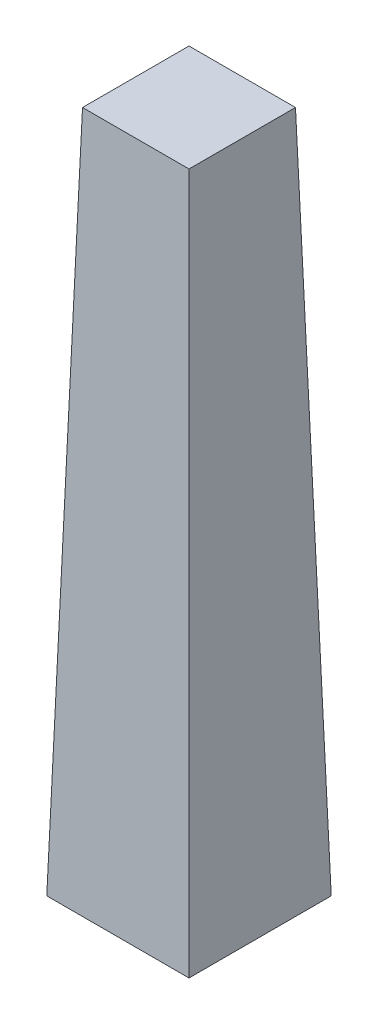
ISO-10303-21;
HEADER;
FILE_DESCRIPTION(('STEP AP214'),'2;1');
FILE_NAME('part.step','',(''),(''),'','','');
FILE_SCHEMA(('AUTOMOTIVE_DESIGN { 1 0 10303 214 1 1 1 1 }'));
ENDSEC;
DATA;
#1=APPLICATION_CONTEXT('core data for automotive mechanical design processes');
#2=APPLICATION_PROTOCOL_DEFINITION('international standard','automotive_design',2000,#1);
#3=PRODUCT_CONTEXT('',#1,'mechanical');
#4=PRODUCT('Part','Part','',(#3));
#5=PRODUCT_RELATED_PRODUCT_CATEGORY('part','',(#4));
#6=PRODUCT_DEFINITION_FORMATION('','',#4);
#7=PRODUCT_DEFINITION_CONTEXT('part definition',#1,'design');
#8=PRODUCT_DEFINITION('design','',#6,#7);
#9=PRODUCT_DEFINITION_SHAPE('','',#8);
#10=(LENGTH_UNIT() NAMED_UNIT(*) SI_UNIT(.MILLI.,.METRE.));
#11=(NAMED_UNIT(*) PLANE_ANGLE_UNIT() SI_UNIT($,.RADIAN.));
#12=(NAMED_UNIT(*) SI_UNIT($,.STERADIAN.) SOLID_ANGLE_UNIT());
#13=UNCERTAINTY_MEASURE_WITH_UNIT(LENGTH_MEASURE(1.E-05),#10,'distance_accuracy_value','');
#14=(GEOMETRIC_REPRESENTATION_CONTEXT(3) GLOBAL_UNCERTAINTY_ASSIGNED_CONTEXT((#13)) GLOBAL_UNIT_ASSIGNED_CONTEXT((#10,
#11,#12)) REPRESENTATION_CONTEXT('',''));
#15=CARTESIAN_POINT('',(0.,0.,0.));
#16=DIRECTION('',(0.,0.,1.));
#17=DIRECTION('',(1.,0.,0.));
#18=AXIS2_PLACEMENT_3D('',#15,#16,#17);
#19=CARTESIAN_POINT('',(0.,0.,0.));
#20=DIRECTION('',(-0.999657324975557,0.0261769483078732,0.));
#21=DIRECTION('',(-0.0261769483078732,-0.999657324975557,0.));
#22=AXIS2_PLACEMENT_3D('',#19,#20,#21);
#23=PLANE('',#22);
#24=DIRECTION('',(0.,0.,1.));
#25=VECTOR('',#24,1.);
#26=CARTESIAN_POINT('',(0.,0.,0.));
#27=LINE('',#26,#25);
#28=CARTESIAN_POINT('',(0.,0.,-25.));
#29=VERTEX_POINT('',#28);
#30=CARTESIAN_POINT('',(0.,0.,0.));
#31=VERTEX_POINT('',#30);
#32=EDGE_CURVE('E86',#29,#31,#27,.T.);
#33=ORIENTED_EDGE('',*,*,#32,.T.);
#34=DIRECTION('',(-0.0261679842649794,-0.99931500198837,0.0261679842649794));
#35=VECTOR('',#34,1.);
#36=CARTESIAN_POINT('',(0.,0.,0.));
#37=LINE('',#36,#35);
#38=CARTESIAN_POINT('',(3.14231058830244,120.,-3.14231058830244));
#39=VERTEX_POINT('',#38);
#40=EDGE_CURVE('E11',#39,#31,#37,.T.);
#41=ORIENTED_EDGE('',*,*,#40,.F.);
#42=DIRECTION('',(0.,0.,-1.));
#43=VECTOR('',#42,1.);
#44=CARTESIAN_POINT('',(3.14231058830244,120.,0.));
#45=LINE('',#44,#43);
#46=CARTESIAN_POINT('',(3.14231058830244,120.,-21.8576894116976));
#47=VERTEX_POINT('',#46);
#48=EDGE_CURVE('E106',#47,#39,#45,.F.);
#49=ORIENTED_EDGE('',*,*,#48,.F.);
#50=DIRECTION('',(-0.0261679842649794,-0.99931500198837,-0.0261679842649794));
#51=VECTOR('',#50,1.);
#52=CARTESIAN_POINT('',(0.0171190850123052,0.653751481194738,-24.9828809149877));
#53=LINE('',#52,#51);
#54=EDGE_CURVE('E98',#47,#29,#53,.T.);
#55=ORIENTED_EDGE('',*,*,#54,.T.);
#56=EDGE_LOOP('',(#33,#41,#49,#55));
#57=FACE_BOUND('',#56,.T.);
#58=ADVANCED_FACE('F39',(#57),#23,.T.);
#59=CARTESIAN_POINT('',(0.,0.,0.));
#60=DIRECTION('',(0.,0.0261769483078732,0.999657324975557));
#61=DIRECTION('',(0.,-0.999657324975557,0.0261769483078732));
#62=AXIS2_PLACEMENT_3D('',#59,#60,#61);
#63=PLANE('',#62);
#64=DIRECTION('',(1.,0.,0.));
#65=VECTOR('',#64,1.);
#66=CARTESIAN_POINT('',(0.,0.,0.));
#67=LINE('',#66,#65);
#68=CARTESIAN_POINT('',(25.,0.,0.));
#69=VERTEX_POINT('',#68);
#70=EDGE_CURVE('E82',#31,#69,#67,.T.);
#71=ORIENTED_EDGE('',*,*,#70,.T.);
#72=DIRECTION('',(0.0261679842649794,-0.99931500198837,0.0261679842649794));
#73=VECTOR('',#72,1.);
#74=CARTESIAN_POINT('',(25.,0.,0.));
#75=LINE('',#74,#73);
#76=CARTESIAN_POINT('',(21.8576894116976,120.,-3.14231058830244));
#77=VERTEX_POINT('',#76);
#78=EDGE_CURVE('E49',#77,#69,#75,.T.);
#79=ORIENTED_EDGE('',*,*,#78,.F.);
#80=DIRECTION('',(-1.,0.,0.));
#81=VECTOR('',#80,1.);
#82=CARTESIAN_POINT('',(0.,120.,-3.14231058830244));
#83=LINE('',#82,#81);
#84=EDGE_CURVE('E94',#39,#77,#83,.F.);
#85=ORIENTED_EDGE('',*,*,#84,.F.);
#86=ORIENTED_EDGE('',*,*,#40,.T.);
#87=EDGE_LOOP('',(#71,#79,#85,#86));
#88=FACE_BOUND('',#87,.T.);
#89=ADVANCED_FACE('F41',(#88),#63,.T.);
#90=CARTESIAN_POINT('',(25.,0.,0.));
#91=DIRECTION('',(0.999657324975557,0.0261769483078732,0.));
#92=DIRECTION('',(-0.0261769483078732,0.999657324975557,0.));
#93=AXIS2_PLACEMENT_3D('',#90,#91,#92);
#94=PLANE('',#93);
#95=DIRECTION('',(0.,0.,-1.));
#96=VECTOR('',#95,1.);
#97=CARTESIAN_POINT('',(25.,0.,0.));
#98=LINE('',#97,#96);
#99=CARTESIAN_POINT('',(25.,0.,-25.));
#100=VERTEX_POINT('',#99);
#101=EDGE_CURVE('E87',#69,#100,#98,.T.);
#102=ORIENTED_EDGE('',*,*,#101,.T.);
#103=DIRECTION('',(0.0261679842649794,-0.99931500198837,-0.0261679842649794));
#104=VECTOR('',#103,1.);
#105=CARTESIAN_POINT('',(24.9828809149877,0.653751481194738,-24.9828809149877));
#106=LINE('',#105,#104);
#107=CARTESIAN_POINT('',(21.8576894116976,120.,-21.8576894116976));
#108=VERTEX_POINT('',#107);
#109=EDGE_CURVE('E110',#108,#100,#106,.T.);
#110=ORIENTED_EDGE('',*,*,#109,.F.);
#111=DIRECTION('',(0.,0.,1.));
#112=VECTOR('',#111,1.);
#113=CARTESIAN_POINT('',(21.8576894116976,120.,0.));
#114=LINE('',#113,#112);
#115=EDGE_CURVE('E61',#77,#108,#114,.F.);
#116=ORIENTED_EDGE('',*,*,#115,.F.);
#117=ORIENTED_EDGE('',*,*,#78,.T.);
#118=EDGE_LOOP('',(#102,#110,#116,#117));
#119=FACE_BOUND('',#118,.T.);
#120=ADVANCED_FACE('F123',(#119),#94,.T.);
#121=CARTESIAN_POINT('',(0.,0.,-25.));
#122=DIRECTION('',(0.,0.0261769483078732,-0.999657324975557));
#123=DIRECTION('',(0.,0.999657324975557,0.0261769483078732));
#124=AXIS2_PLACEMENT_3D('',#121,#122,#123);
#125=PLANE('',#124);
#126=DIRECTION('',(-1.,0.,0.));
#127=VECTOR('',#126,1.);
#128=CARTESIAN_POINT('',(0.,0.,-25.));
#129=LINE('',#128,#127);
#130=EDGE_CURVE('E104',#100,#29,#129,.T.);
#131=ORIENTED_EDGE('',*,*,#130,.T.);
#132=ORIENTED_EDGE('',*,*,#54,.F.);
#133=DIRECTION('',(1.,0.,0.));
#134=VECTOR('',#133,1.);
#135=CARTESIAN_POINT('',(0.,120.,-21.8576894116976));
#136=LINE('',#135,#134);
#137=EDGE_CURVE('E43',#108,#47,#136,.F.);
#138=ORIENTED_EDGE('',*,*,#137,.F.);
#139=ORIENTED_EDGE('',*,*,#109,.T.);
#140=EDGE_LOOP('',(#131,#132,#138,#139));
#141=FACE_BOUND('',#140,.T.);
#142=ADVANCED_FACE('F125',(#141),#125,.T.);
#143=CARTESIAN_POINT('',(0.,120.,0.));
#144=DIRECTION('',(0.,-1.,0.));
#145=DIRECTION('',(0.,0.,-1.));
#146=AXIS2_PLACEMENT_3D('',#143,#144,#145);
#147=PLANE('',#146);
#148=ORIENTED_EDGE('',*,*,#48,.T.);
#149=ORIENTED_EDGE('',*,*,#84,.T.);
#150=ORIENTED_EDGE('',*,*,#115,.T.);
#151=ORIENTED_EDGE('',*,*,#137,.T.);
#152=EDGE_LOOP('',(#148,#149,#150,#151));
#153=FACE_BOUND('',#152,.T.);
#154=ADVANCED_FACE('F121',(#153),#147,.F.);
#155=CARTESIAN_POINT('',(0.,0.,0.));
#156=DIRECTION('',(0.,-1.,0.));
#157=DIRECTION('',(0.,0.,-1.));
#158=AXIS2_PLACEMENT_3D('',#155,#156,#157);
#159=PLANE('',#158);
#160=ORIENTED_EDGE('',*,*,#32,.F.);
#161=ORIENTED_EDGE('',*,*,#130,.F.);
#162=ORIENTED_EDGE('',*,*,#101,.F.);
#163=ORIENTED_EDGE('',*,*,#70,.F.);
#164=EDGE_LOOP('',(#160,#161,#162,#163));
#165=FACE_BOUND('',#164,.T.);
#166=ADVANCED_FACE('F83',(#165),#159,.T.);
#167=CLOSED_SHELL('',(#58,#89,#120,#142,#154,#166));
#168=MANIFOLD_SOLID_BREP('B2',#167);
#169=ADVANCED_BREP_SHAPE_REPRESENTATION('',(#18,#168),#14);
#170=SHAPE_DEFINITION_REPRESENTATION(#9,#169);
ENDSEC;
END-ISO-10303-21;
